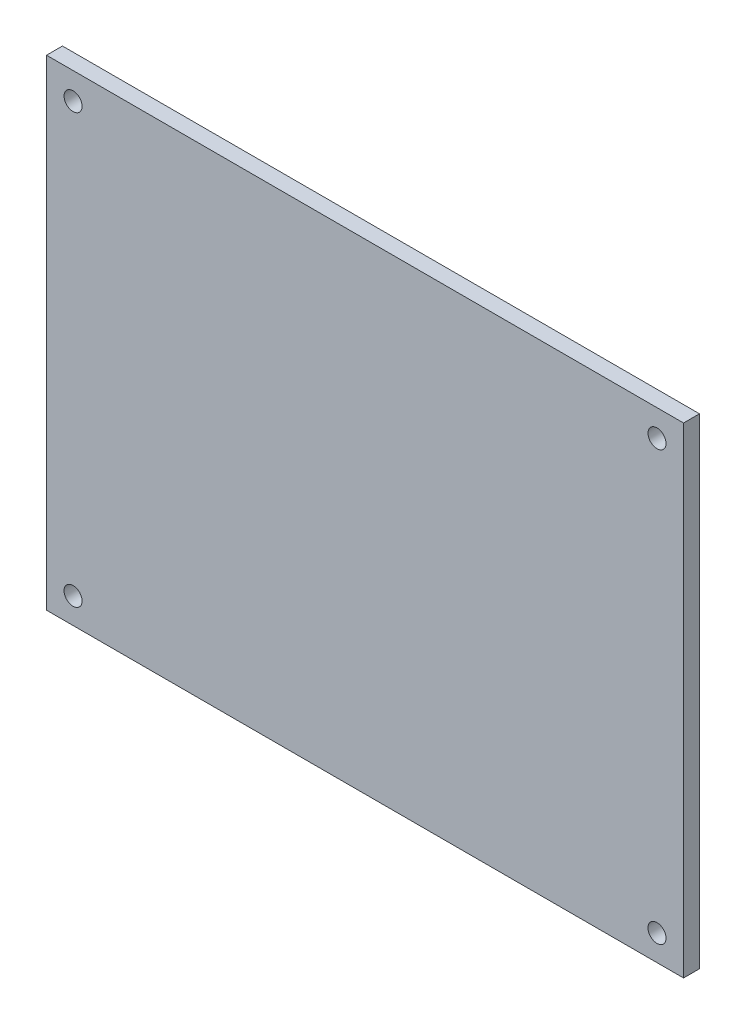
ISO-10303-21;
HEADER;
FILE_DESCRIPTION(('STEP AP214'),'2;1');
FILE_NAME('part.step','',(''),(''),'','','');
FILE_SCHEMA(('AUTOMOTIVE_DESIGN { 1 0 10303 214 1 1 1 1 }'));
ENDSEC;
DATA;
#1=APPLICATION_CONTEXT('core data for automotive mechanical design processes');
#2=APPLICATION_PROTOCOL_DEFINITION('international standard','automotive_design',2000,#1);
#3=PRODUCT_CONTEXT('',#1,'mechanical');
#4=PRODUCT('Part','Part','',(#3));
#5=PRODUCT_RELATED_PRODUCT_CATEGORY('part','',(#4));
#6=PRODUCT_DEFINITION_FORMATION('','',#4);
#7=PRODUCT_DEFINITION_CONTEXT('part definition',#1,'design');
#8=PRODUCT_DEFINITION('design','',#6,#7);
#9=PRODUCT_DEFINITION_SHAPE('','',#8);
#10=(LENGTH_UNIT() NAMED_UNIT(*) SI_UNIT(.MILLI.,.METRE.));
#11=(NAMED_UNIT(*) PLANE_ANGLE_UNIT() SI_UNIT($,.RADIAN.));
#12=(NAMED_UNIT(*) SI_UNIT($,.STERADIAN.) SOLID_ANGLE_UNIT());
#13=UNCERTAINTY_MEASURE_WITH_UNIT(LENGTH_MEASURE(1.E-05),#10,'distance_accuracy_value','');
#14=(GEOMETRIC_REPRESENTATION_CONTEXT(3) GLOBAL_UNCERTAINTY_ASSIGNED_CONTEXT((#13)) GLOBAL_UNIT_ASSIGNED_CONTEXT((#10,
#11,#12)) REPRESENTATION_CONTEXT('',''));
#15=CARTESIAN_POINT('',(0.,0.,0.));
#16=DIRECTION('',(0.,0.,1.));
#17=DIRECTION('',(1.,0.,0.));
#18=AXIS2_PLACEMENT_3D('',#15,#16,#17);
#19=CARTESIAN_POINT('',(0.,90.54407714,3.));
#20=DIRECTION('',(1.,0.,0.));
#21=DIRECTION('',(0.,1.,0.));
#22=AXIS2_PLACEMENT_3D('',#19,#20,#21);
#23=PLANE('',#22);
#24=DIRECTION('',(0.,-1.,0.));
#25=VECTOR('',#24,1.);
#26=CARTESIAN_POINT('',(0.,90.54407714,0.));
#27=LINE('',#26,#25);
#28=CARTESIAN_POINT('',(0.,90.54407714,0.));
#29=VERTEX_POINT('',#28);
#30=CARTESIAN_POINT('',(0.,0.,0.));
#31=VERTEX_POINT('',#30);
#32=EDGE_CURVE('E102',#29,#31,#27,.T.);
#33=ORIENTED_EDGE('',*,*,#32,.T.);
#34=DIRECTION('',(0.,0.,-1.));
#35=VECTOR('',#34,1.);
#36=CARTESIAN_POINT('',(0.,0.,3.));
#37=LINE('',#36,#35);
#38=CARTESIAN_POINT('',(0.,0.,3.));
#39=VERTEX_POINT('',#38);
#40=EDGE_CURVE('E11',#39,#31,#37,.T.);
#41=ORIENTED_EDGE('',*,*,#40,.F.);
#42=DIRECTION('',(0.,-1.,0.));
#43=VECTOR('',#42,1.);
#44=CARTESIAN_POINT('',(0.,90.54407714,3.));
#45=LINE('',#44,#43);
#46=CARTESIAN_POINT('',(0.,90.54407714,3.));
#47=VERTEX_POINT('',#46);
#48=EDGE_CURVE('E90',#47,#39,#45,.T.);
#49=ORIENTED_EDGE('',*,*,#48,.F.);
#50=DIRECTION('',(0.,0.,-1.));
#51=VECTOR('',#50,1.);
#52=CARTESIAN_POINT('',(0.,90.54407714,3.));
#53=LINE('',#52,#51);
#54=EDGE_CURVE('E98',#47,#29,#53,.T.);
#55=ORIENTED_EDGE('',*,*,#54,.T.);
#56=EDGE_LOOP('',(#33,#41,#49,#55));
#57=FACE_BOUND('',#56,.T.);
#58=ADVANCED_FACE('F39',(#57),#23,.F.);
#59=CARTESIAN_POINT('',(0.,0.,3.));
#60=DIRECTION('',(0.,1.,0.));
#61=DIRECTION('',(0.,0.,1.));
#62=AXIS2_PLACEMENT_3D('',#59,#60,#61);
#63=PLANE('',#62);
#64=DIRECTION('',(1.,0.,0.));
#65=VECTOR('',#64,1.);
#66=CARTESIAN_POINT('',(0.,0.,0.));
#67=LINE('',#66,#65);
#68=CARTESIAN_POINT('',(120.,0.,0.));
#69=VERTEX_POINT('',#68);
#70=EDGE_CURVE('E94',#31,#69,#67,.T.);
#71=ORIENTED_EDGE('',*,*,#70,.T.);
#72=DIRECTION('',(0.,0.,-1.));
#73=VECTOR('',#72,1.);
#74=CARTESIAN_POINT('',(120.,0.,3.));
#75=LINE('',#74,#73);
#76=CARTESIAN_POINT('',(120.,0.,3.));
#77=VERTEX_POINT('',#76);
#78=EDGE_CURVE('E47',#77,#69,#75,.T.);
#79=ORIENTED_EDGE('',*,*,#78,.F.);
#80=DIRECTION('',(1.,0.,0.));
#81=VECTOR('',#80,1.);
#82=CARTESIAN_POINT('',(0.,0.,3.));
#83=LINE('',#82,#81);
#84=EDGE_CURVE('E85',#39,#77,#83,.T.);
#85=ORIENTED_EDGE('',*,*,#84,.F.);
#86=ORIENTED_EDGE('',*,*,#40,.T.);
#87=EDGE_LOOP('',(#71,#79,#85,#86));
#88=FACE_BOUND('',#87,.T.);
#89=ADVANCED_FACE('F93',(#88),#63,.F.);
#90=CARTESIAN_POINT('',(120.,90.54407714,3.));
#91=DIRECTION('',(-1.,0.,0.));
#92=DIRECTION('',(0.,-1.,0.));
#93=AXIS2_PLACEMENT_3D('',#90,#91,#92);
#94=PLANE('',#93);
#95=DIRECTION('',(0.,1.,0.));
#96=VECTOR('',#95,1.);
#97=CARTESIAN_POINT('',(120.,90.54407714,0.));
#98=LINE('',#97,#96);
#99=CARTESIAN_POINT('',(120.,90.54407714,0.));
#100=VERTEX_POINT('',#99);
#101=EDGE_CURVE('E72',#69,#100,#98,.T.);
#102=ORIENTED_EDGE('',*,*,#101,.T.);
#103=DIRECTION('',(0.,0.,-1.));
#104=VECTOR('',#103,1.);
#105=CARTESIAN_POINT('',(120.,90.54407714,3.));
#106=LINE('',#105,#104);
#107=CARTESIAN_POINT('',(120.,90.54407714,3.));
#108=VERTEX_POINT('',#107);
#109=EDGE_CURVE('E95',#108,#100,#106,.T.);
#110=ORIENTED_EDGE('',*,*,#109,.F.);
#111=DIRECTION('',(0.,1.,0.));
#112=VECTOR('',#111,1.);
#113=CARTESIAN_POINT('',(120.,90.54407714,3.));
#114=LINE('',#113,#112);
#115=EDGE_CURVE('E88',#77,#108,#114,.T.);
#116=ORIENTED_EDGE('',*,*,#115,.F.);
#117=ORIENTED_EDGE('',*,*,#78,.T.);
#118=EDGE_LOOP('',(#102,#110,#116,#117));
#119=FACE_BOUND('',#118,.T.);
#120=ADVANCED_FACE('F96',(#119),#94,.F.);
#121=CARTESIAN_POINT('',(0.,90.54407714,3.));
#122=DIRECTION('',(0.,-1.,0.));
#123=DIRECTION('',(0.,0.,-1.));
#124=AXIS2_PLACEMENT_3D('',#121,#122,#123);
#125=PLANE('',#124);
#126=DIRECTION('',(-1.,0.,0.));
#127=VECTOR('',#126,1.);
#128=CARTESIAN_POINT('',(0.,90.54407714,0.));
#129=LINE('',#128,#127);
#130=EDGE_CURVE('E78',#100,#29,#129,.T.);
#131=ORIENTED_EDGE('',*,*,#130,.T.);
#132=ORIENTED_EDGE('',*,*,#54,.F.);
#133=DIRECTION('',(-1.,0.,0.));
#134=VECTOR('',#133,1.);
#135=CARTESIAN_POINT('',(0.,90.54407714,3.));
#136=LINE('',#135,#134);
#137=EDGE_CURVE('E55',#108,#47,#136,.T.);
#138=ORIENTED_EDGE('',*,*,#137,.F.);
#139=ORIENTED_EDGE('',*,*,#109,.T.);
#140=EDGE_LOOP('',(#131,#132,#138,#139));
#141=FACE_BOUND('',#140,.T.);
#142=ADVANCED_FACE('F110',(#141),#125,.F.);
#143=CARTESIAN_POINT('',(0.,0.,3.));
#144=DIRECTION('',(0.,0.,1.));
#145=DIRECTION('',(1.,0.,0.));
#146=AXIS2_PLACEMENT_3D('',#143,#144,#145);
#147=PLANE('',#146);
#148=CARTESIAN_POINT('',(4.99999999999998,85.54407714,3.));
#149=DIRECTION('',(0.,0.,1.));
#150=DIRECTION('',(1.,0.,0.));
#151=AXIS2_PLACEMENT_3D('',#148,#149,#150);
#152=CIRCLE('',#151,1.69999999999999);
#153=CARTESIAN_POINT('',(6.69999999999996,85.54407714,3.));
#154=VERTEX_POINT('',#153);
#155=EDGE_CURVE('E136',#154,#154,#152,.T.);
#156=ORIENTED_EDGE('',*,*,#155,.F.);
#157=EDGE_LOOP('',(#156));
#158=FACE_BOUND('',#157,.T.);
#159=CARTESIAN_POINT('',(115.,4.83700643292927,3.));
#160=DIRECTION('',(0.,0.,1.));
#161=DIRECTION('',(1.,0.,0.));
#162=AXIS2_PLACEMENT_3D('',#159,#160,#161);
#163=CIRCLE('',#162,1.69999999999999);
#164=CARTESIAN_POINT('',(116.7,4.83700643292927,3.));
#165=VERTEX_POINT('',#164);
#166=EDGE_CURVE('E130',#165,#165,#163,.T.);
#167=ORIENTED_EDGE('',*,*,#166,.F.);
#168=EDGE_LOOP('',(#167));
#169=FACE_BOUND('',#168,.T.);
#170=CARTESIAN_POINT('',(4.99999999999998,4.83700643292927,3.));
#171=DIRECTION('',(0.,0.,1.));
#172=DIRECTION('',(1.,0.,0.));
#173=AXIS2_PLACEMENT_3D('',#170,#171,#172);
#174=CIRCLE('',#173,1.69999999999999);
#175=CARTESIAN_POINT('',(6.69999999999997,4.83700643292927,3.));
#176=VERTEX_POINT('',#175);
#177=EDGE_CURVE('E124',#176,#176,#174,.T.);
#178=ORIENTED_EDGE('',*,*,#177,.F.);
#179=EDGE_LOOP('',(#178));
#180=FACE_BOUND('',#179,.T.);
#181=CARTESIAN_POINT('',(115.,85.54407714,3.));
#182=DIRECTION('',(0.,0.,1.));
#183=DIRECTION('',(1.,0.,0.));
#184=AXIS2_PLACEMENT_3D('',#181,#182,#183);
#185=CIRCLE('',#184,1.69999999999999);
#186=CARTESIAN_POINT('',(116.7,85.54407714,3.));
#187=VERTEX_POINT('',#186);
#188=EDGE_CURVE('E118',#187,#187,#185,.T.);
#189=ORIENTED_EDGE('',*,*,#188,.F.);
#190=EDGE_LOOP('',(#189));
#191=FACE_BOUND('',#190,.T.);
#192=ORIENTED_EDGE('',*,*,#48,.T.);
#193=ORIENTED_EDGE('',*,*,#84,.T.);
#194=ORIENTED_EDGE('',*,*,#115,.T.);
#195=ORIENTED_EDGE('',*,*,#137,.T.);
#196=EDGE_LOOP('',(#192,#193,#194,#195));
#197=FACE_BOUND('',#196,.T.);
#198=ADVANCED_FACE('F86',(#158,#169,#180,#191,#197),#147,.T.);
#199=CARTESIAN_POINT('',(0.,0.,0.));
#200=DIRECTION('',(0.,0.,1.));
#201=DIRECTION('',(1.,0.,0.));
#202=AXIS2_PLACEMENT_3D('',#199,#200,#201);
#203=PLANE('',#202);
#204=CARTESIAN_POINT('',(4.99999999999998,85.54407714,0.));
#205=DIRECTION('',(0.,0.,1.));
#206=DIRECTION('',(1.,0.,0.));
#207=AXIS2_PLACEMENT_3D('',#204,#205,#206);
#208=CIRCLE('',#207,1.7);
#209=CARTESIAN_POINT('',(6.69999999999998,85.54407714,0.));
#210=VERTEX_POINT('',#209);
#211=EDGE_CURVE('E133',#210,#210,#208,.T.);
#212=ORIENTED_EDGE('',*,*,#211,.T.);
#213=EDGE_LOOP('',(#212));
#214=FACE_BOUND('',#213,.T.);
#215=CARTESIAN_POINT('',(115.,4.83700643292927,0.));
#216=DIRECTION('',(0.,0.,1.));
#217=DIRECTION('',(1.,0.,0.));
#218=AXIS2_PLACEMENT_3D('',#215,#216,#217);
#219=CIRCLE('',#218,1.69999999999999);
#220=CARTESIAN_POINT('',(116.7,4.83700643292927,0.));
#221=VERTEX_POINT('',#220);
#222=EDGE_CURVE('E127',#221,#221,#219,.T.);
#223=ORIENTED_EDGE('',*,*,#222,.T.);
#224=EDGE_LOOP('',(#223));
#225=FACE_BOUND('',#224,.T.);
#226=CARTESIAN_POINT('',(4.99999999999998,4.83700643292927,0.));
#227=DIRECTION('',(0.,0.,1.));
#228=DIRECTION('',(1.,0.,0.));
#229=AXIS2_PLACEMENT_3D('',#226,#227,#228);
#230=CIRCLE('',#229,1.7);
#231=CARTESIAN_POINT('',(6.69999999999998,4.83700643292927,0.));
#232=VERTEX_POINT('',#231);
#233=EDGE_CURVE('E121',#232,#232,#230,.T.);
#234=ORIENTED_EDGE('',*,*,#233,.T.);
#235=EDGE_LOOP('',(#234));
#236=FACE_BOUND('',#235,.T.);
#237=CARTESIAN_POINT('',(115.,85.54407714,0.));
#238=DIRECTION('',(0.,0.,1.));
#239=DIRECTION('',(1.,0.,0.));
#240=AXIS2_PLACEMENT_3D('',#237,#238,#239);
#241=CIRCLE('',#240,1.69999999999999);
#242=CARTESIAN_POINT('',(116.7,85.54407714,0.));
#243=VERTEX_POINT('',#242);
#244=EDGE_CURVE('E105',#243,#243,#241,.T.);
#245=ORIENTED_EDGE('',*,*,#244,.T.);
#246=EDGE_LOOP('',(#245));
#247=FACE_BOUND('',#246,.T.);
#248=ORIENTED_EDGE('',*,*,#32,.F.);
#249=ORIENTED_EDGE('',*,*,#130,.F.);
#250=ORIENTED_EDGE('',*,*,#101,.F.);
#251=ORIENTED_EDGE('',*,*,#70,.F.);
#252=EDGE_LOOP('',(#248,#249,#250,#251));
#253=FACE_BOUND('',#252,.T.);
#254=ADVANCED_FACE('F113',(#214,#225,#236,#247,#253),#203,.F.);
#255=CARTESIAN_POINT('',(115.,85.54407714,3.));
#256=DIRECTION('',(0.,0.,1.));
#257=DIRECTION('',(1.,0.,0.));
#258=AXIS2_PLACEMENT_3D('',#255,#256,#257);
#259=CYLINDRICAL_SURFACE('',#258,1.69999999999999);
#260=ORIENTED_EDGE('',*,*,#244,.F.);
#261=EDGE_LOOP('',(#260));
#262=FACE_BOUND('',#261,.T.);
#263=ORIENTED_EDGE('',*,*,#188,.T.);
#264=EDGE_LOOP('',(#263));
#265=FACE_BOUND('',#264,.T.);
#266=ADVANCED_FACE('F151',(#262,#265),#259,.F.);
#267=CARTESIAN_POINT('',(4.99999999999998,4.83700643292927,3.));
#268=DIRECTION('',(0.,0.,1.));
#269=DIRECTION('',(1.,0.,0.));
#270=AXIS2_PLACEMENT_3D('',#267,#268,#269);
#271=CYLINDRICAL_SURFACE('',#270,1.69999999999999);
#272=ORIENTED_EDGE('',*,*,#233,.F.);
#273=EDGE_LOOP('',(#272));
#274=FACE_BOUND('',#273,.T.);
#275=ORIENTED_EDGE('',*,*,#177,.T.);
#276=EDGE_LOOP('',(#275));
#277=FACE_BOUND('',#276,.T.);
#278=ADVANCED_FACE('F153',(#274,#277),#271,.F.);
#279=CARTESIAN_POINT('',(115.,4.83700643292927,3.));
#280=DIRECTION('',(0.,0.,1.));
#281=DIRECTION('',(1.,0.,0.));
#282=AXIS2_PLACEMENT_3D('',#279,#280,#281);
#283=CYLINDRICAL_SURFACE('',#282,1.69999999999999);
#284=ORIENTED_EDGE('',*,*,#222,.F.);
#285=EDGE_LOOP('',(#284));
#286=FACE_BOUND('',#285,.T.);
#287=ORIENTED_EDGE('',*,*,#166,.T.);
#288=EDGE_LOOP('',(#287));
#289=FACE_BOUND('',#288,.T.);
#290=ADVANCED_FACE('F160',(#286,#289),#283,.F.);
#291=CARTESIAN_POINT('',(4.99999999999998,85.54407714,3.));
#292=DIRECTION('',(0.,0.,1.));
#293=DIRECTION('',(1.,0.,0.));
#294=AXIS2_PLACEMENT_3D('',#291,#292,#293);
#295=CYLINDRICAL_SURFACE('',#294,1.69999999999999);
#296=ORIENTED_EDGE('',*,*,#211,.F.);
#297=EDGE_LOOP('',(#296));
#298=FACE_BOUND('',#297,.T.);
#299=ORIENTED_EDGE('',*,*,#155,.T.);
#300=EDGE_LOOP('',(#299));
#301=FACE_BOUND('',#300,.T.);
#302=ADVANCED_FACE('F140',(#298,#301),#295,.F.);
#303=CLOSED_SHELL('',(#58,#89,#120,#142,#198,#254,#266,#278,#290,#302));
#304=MANIFOLD_SOLID_BREP('B2',#303);
#305=ADVANCED_BREP_SHAPE_REPRESENTATION('',(#18,#304),#14);
#306=SHAPE_DEFINITION_REPRESENTATION(#9,#305);
ENDSEC;
END-ISO-10303-21;
